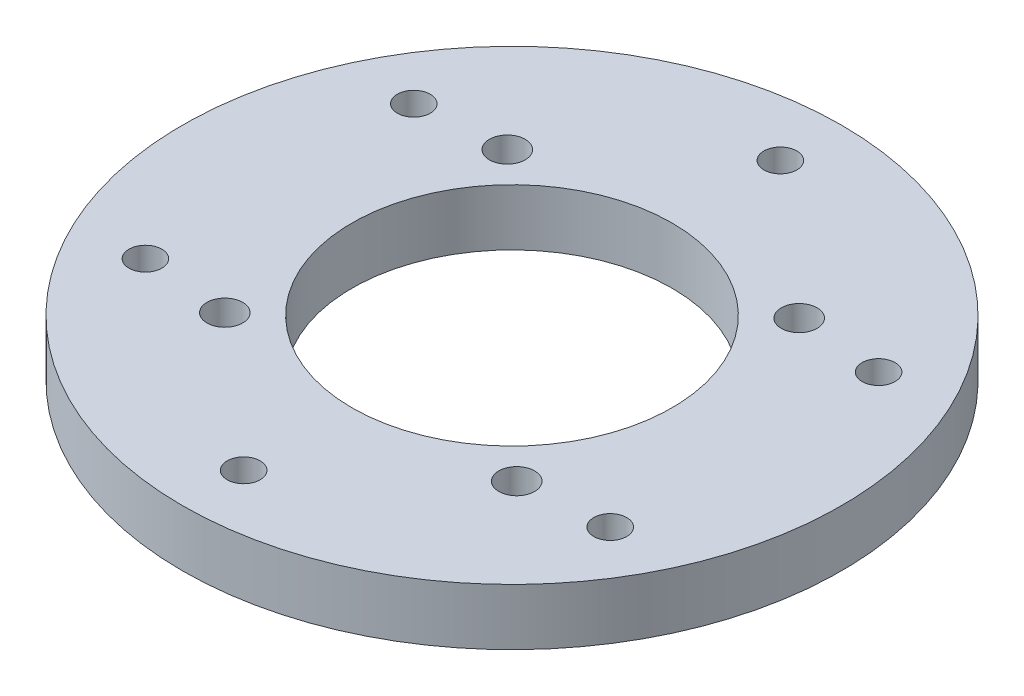
ISO-10303-21;
HEADER;
FILE_DESCRIPTION(('STEP AP214'),'2;1');
FILE_NAME('part.step','',(''),(''),'','','');
FILE_SCHEMA(('AUTOMOTIVE_DESIGN { 1 0 10303 214 1 1 1 1 }'));
ENDSEC;
DATA;
#1=APPLICATION_CONTEXT('core data for automotive mechanical design processes');
#2=APPLICATION_PROTOCOL_DEFINITION('international standard','automotive_design',2000,#1);
#3=PRODUCT_CONTEXT('',#1,'mechanical');
#4=PRODUCT('Part','Part','',(#3));
#5=PRODUCT_RELATED_PRODUCT_CATEGORY('part','',(#4));
#6=PRODUCT_DEFINITION_FORMATION('','',#4);
#7=PRODUCT_DEFINITION_CONTEXT('part definition',#1,'design');
#8=PRODUCT_DEFINITION('design','',#6,#7);
#9=PRODUCT_DEFINITION_SHAPE('','',#8);
#10=(LENGTH_UNIT() NAMED_UNIT(*) SI_UNIT(.MILLI.,.METRE.));
#11=(NAMED_UNIT(*) PLANE_ANGLE_UNIT() SI_UNIT($,.RADIAN.));
#12=(NAMED_UNIT(*) SI_UNIT($,.STERADIAN.) SOLID_ANGLE_UNIT());
#13=UNCERTAINTY_MEASURE_WITH_UNIT(LENGTH_MEASURE(1.E-05),#10,'distance_accuracy_value','');
#14=(GEOMETRIC_REPRESENTATION_CONTEXT(3) GLOBAL_UNCERTAINTY_ASSIGNED_CONTEXT((#13)) GLOBAL_UNIT_ASSIGNED_CONTEXT((#10,
#11,#12)) REPRESENTATION_CONTEXT('',''));
#15=CARTESIAN_POINT('',(0.,0.,0.));
#16=DIRECTION('',(0.,0.,1.));
#17=DIRECTION('',(1.,0.,0.));
#18=AXIS2_PLACEMENT_3D('',#15,#16,#17);
#19=CARTESIAN_POINT('',(0.,6.,0.));
#20=DIRECTION('',(0.,-1.,0.));
#21=DIRECTION('',(0.,0.,-1.));
#22=AXIS2_PLACEMENT_3D('',#19,#20,#21);
#23=CYLINDRICAL_SURFACE('',#22,35.);
#24=CARTESIAN_POINT('',(0.,6.,0.));
#25=DIRECTION('',(0.,1.,0.));
#26=DIRECTION('',(0.,0.,1.));
#27=AXIS2_PLACEMENT_3D('',#24,#25,#26);
#28=CIRCLE('',#27,35.);
#29=CARTESIAN_POINT('',(0.,6.,35.));
#30=VERTEX_POINT('',#29);
#31=EDGE_CURVE('E10',#30,#30,#28,.T.);
#32=ORIENTED_EDGE('',*,*,#31,.F.);
#33=EDGE_LOOP('',(#32));
#34=FACE_BOUND('',#33,.T.);
#35=CARTESIAN_POINT('',(0.,0.,0.));
#36=DIRECTION('',(0.,1.,0.));
#37=DIRECTION('',(0.,0.,1.));
#38=AXIS2_PLACEMENT_3D('',#35,#36,#37);
#39=CIRCLE('',#38,35.);
#40=CARTESIAN_POINT('',(0.,0.,35.));
#41=VERTEX_POINT('',#40);
#42=EDGE_CURVE('E44',#41,#41,#39,.T.);
#43=ORIENTED_EDGE('',*,*,#42,.T.);
#44=EDGE_LOOP('',(#43));
#45=FACE_BOUND('',#44,.T.);
#46=ADVANCED_FACE('F37',(#34,#45),#23,.T.);
#47=CARTESIAN_POINT('',(0.,6.,0.));
#48=DIRECTION('',(0.,1.,0.));
#49=DIRECTION('',(0.,0.,1.));
#50=AXIS2_PLACEMENT_3D('',#47,#48,#49);
#51=PLANE('',#50);
#52=CARTESIAN_POINT('',(0.,6.,0.));
#53=DIRECTION('',(0.,1.,0.));
#54=DIRECTION('',(0.,0.,1.));
#55=AXIS2_PLACEMENT_3D('',#52,#53,#54);
#56=CIRCLE('',#55,17.);
#57=CARTESIAN_POINT('',(0.,6.,17.));
#58=VERTEX_POINT('',#57);
#59=EDGE_CURVE('E164',#58,#58,#56,.T.);
#60=ORIENTED_EDGE('',*,*,#59,.F.);
#61=EDGE_LOOP('',(#60));
#62=FACE_BOUND('',#61,.T.);
#63=CARTESIAN_POINT('',(-15.5,6.,-15.));
#64=DIRECTION('',(0.,1.,0.));
#65=DIRECTION('',(0.,0.,1.));
#66=AXIS2_PLACEMENT_3D('',#63,#64,#65);
#67=CIRCLE('',#66,1.90000000000001);
#68=CARTESIAN_POINT('',(-15.5,6.,-13.1));
#69=VERTEX_POINT('',#68);
#70=EDGE_CURVE('E57',#69,#69,#67,.T.);
#71=ORIENTED_EDGE('',*,*,#70,.F.);
#72=EDGE_LOOP('',(#71));
#73=FACE_BOUND('',#72,.T.);
#74=CARTESIAN_POINT('',(15.5,6.,-15.));
#75=DIRECTION('',(0.,1.,0.));
#76=DIRECTION('',(0.,0.,1.));
#77=AXIS2_PLACEMENT_3D('',#74,#75,#76);
#78=CIRCLE('',#77,1.90000000000001);
#79=CARTESIAN_POINT('',(15.5,6.,-13.1));
#80=VERTEX_POINT('',#79);
#81=EDGE_CURVE('E88',#80,#80,#78,.T.);
#82=ORIENTED_EDGE('',*,*,#81,.F.);
#83=EDGE_LOOP('',(#82));
#84=FACE_BOUND('',#83,.T.);
#85=CARTESIAN_POINT('',(15.5,6.,15.));
#86=DIRECTION('',(0.,1.,0.));
#87=DIRECTION('',(0.,0.,1.));
#88=AXIS2_PLACEMENT_3D('',#85,#86,#87);
#89=CIRCLE('',#88,1.90000000000001);
#90=CARTESIAN_POINT('',(15.5,6.,16.9));
#91=VERTEX_POINT('',#90);
#92=EDGE_CURVE('E91',#91,#91,#89,.T.);
#93=ORIENTED_EDGE('',*,*,#92,.F.);
#94=EDGE_LOOP('',(#93));
#95=FACE_BOUND('',#94,.T.);
#96=CARTESIAN_POINT('',(-15.5,6.,15.));
#97=DIRECTION('',(0.,1.,0.));
#98=DIRECTION('',(0.,0.,1.));
#99=AXIS2_PLACEMENT_3D('',#96,#97,#98);
#100=CIRCLE('',#99,1.90000000000001);
#101=CARTESIAN_POINT('',(-15.5,6.,16.9));
#102=VERTEX_POINT('',#101);
#103=EDGE_CURVE('E94',#102,#102,#100,.T.);
#104=ORIENTED_EDGE('',*,*,#103,.F.);
#105=EDGE_LOOP('',(#104));
#106=FACE_BOUND('',#105,.T.);
#107=CARTESIAN_POINT('',(24.6817240078563,6.,-14.2500000000003));
#108=DIRECTION('',(0.,1.,0.));
#109=DIRECTION('',(0.,0.,1.));
#110=AXIS2_PLACEMENT_3D('',#107,#108,#109);
#111=CIRCLE('',#110,1.75000000000001);
#112=CARTESIAN_POINT('',(24.6817240078563,6.,-12.5000000000003));
#113=VERTEX_POINT('',#112);
#114=EDGE_CURVE('E97',#113,#113,#111,.T.);
#115=ORIENTED_EDGE('',*,*,#114,.F.);
#116=EDGE_LOOP('',(#115));
#117=FACE_BOUND('',#116,.T.);
#118=CARTESIAN_POINT('',(24.6817240078566,6.,14.2499999999998));
#119=DIRECTION('',(0.,1.,0.));
#120=DIRECTION('',(0.,0.,1.));
#121=AXIS2_PLACEMENT_3D('',#118,#119,#120);
#122=CIRCLE('',#121,1.75000000000001);
#123=CARTESIAN_POINT('',(24.6817240078566,6.,15.9999999999998));
#124=VERTEX_POINT('',#123);
#125=EDGE_CURVE('E103',#124,#124,#122,.T.);
#126=ORIENTED_EDGE('',*,*,#125,.F.);
#127=EDGE_LOOP('',(#126));
#128=FACE_BOUND('',#127,.T.);
#129=CARTESIAN_POINT('',(0.,6.,28.5));
#130=DIRECTION('',(0.,1.,0.));
#131=DIRECTION('',(0.,0.,1.));
#132=AXIS2_PLACEMENT_3D('',#129,#130,#131);
#133=CIRCLE('',#132,1.75000000000001);
#134=CARTESIAN_POINT('',(0.,6.,30.25));
#135=VERTEX_POINT('',#134);
#136=EDGE_CURVE('E109',#135,#135,#133,.T.);
#137=ORIENTED_EDGE('',*,*,#136,.F.);
#138=EDGE_LOOP('',(#137));
#139=FACE_BOUND('',#138,.T.);
#140=CARTESIAN_POINT('',(-24.6817240078564,6.,14.2500000000001));
#141=DIRECTION('',(0.,1.,0.));
#142=DIRECTION('',(0.,0.,1.));
#143=AXIS2_PLACEMENT_3D('',#140,#141,#142);
#144=CIRCLE('',#143,1.75000000000001);
#145=CARTESIAN_POINT('',(-24.6817240078564,6.,16.0000000000001));
#146=VERTEX_POINT('',#145);
#147=EDGE_CURVE('E115',#146,#146,#144,.T.);
#148=ORIENTED_EDGE('',*,*,#147,.F.);
#149=EDGE_LOOP('',(#148));
#150=FACE_BOUND('',#149,.T.);
#151=CARTESIAN_POINT('',(-24.6817240078565,6.,-14.2499999999999));
#152=DIRECTION('',(0.,1.,0.));
#153=DIRECTION('',(0.,0.,1.));
#154=AXIS2_PLACEMENT_3D('',#151,#152,#153);
#155=CIRCLE('',#154,1.75000000000001);
#156=CARTESIAN_POINT('',(-24.6817240078565,6.,-12.4999999999999));
#157=VERTEX_POINT('',#156);
#158=EDGE_CURVE('E121',#157,#157,#155,.T.);
#159=ORIENTED_EDGE('',*,*,#158,.F.);
#160=EDGE_LOOP('',(#159));
#161=FACE_BOUND('',#160,.T.);
#162=CARTESIAN_POINT('',(0.,6.,-28.5));
#163=DIRECTION('',(0.,1.,0.));
#164=DIRECTION('',(0.,0.,1.));
#165=AXIS2_PLACEMENT_3D('',#162,#163,#164);
#166=CIRCLE('',#165,1.75000000000001);
#167=CARTESIAN_POINT('',(0.,6.,-26.75));
#168=VERTEX_POINT('',#167);
#169=EDGE_CURVE('E126',#168,#168,#166,.T.);
#170=ORIENTED_EDGE('',*,*,#169,.F.);
#171=EDGE_LOOP('',(#170));
#172=FACE_BOUND('',#171,.T.);
#173=ORIENTED_EDGE('',*,*,#31,.T.);
#174=EDGE_LOOP('',(#173));
#175=FACE_BOUND('',#174,.T.);
#176=ADVANCED_FACE('F148',(#62,#73,#84,#95,#106,#117,#128,#139,#150,#161,#172,#175),#51,.T.);
#177=CARTESIAN_POINT('',(0.,0.,0.));
#178=DIRECTION('',(0.,1.,0.));
#179=DIRECTION('',(0.,0.,1.));
#180=AXIS2_PLACEMENT_3D('',#177,#178,#179);
#181=PLANE('',#180);
#182=CARTESIAN_POINT('',(0.,0.,0.));
#183=DIRECTION('',(0.,-1.,0.));
#184=DIRECTION('',(0.,0.,-1.));
#185=AXIS2_PLACEMENT_3D('',#182,#183,#184);
#186=CIRCLE('',#185,17.);
#187=CARTESIAN_POINT('',(0.,0.,-17.));
#188=VERTEX_POINT('',#187);
#189=EDGE_CURVE('E257',#188,#188,#186,.T.);
#190=ORIENTED_EDGE('',*,*,#189,.F.);
#191=EDGE_LOOP('',(#190));
#192=FACE_BOUND('',#191,.T.);
#193=CARTESIAN_POINT('',(15.5,0.,-15.));
#194=DIRECTION('',(0.,-1.,0.));
#195=DIRECTION('',(0.,0.,-1.));
#196=AXIS2_PLACEMENT_3D('',#193,#194,#195);
#197=CIRCLE('',#196,3.50000000000001);
#198=CARTESIAN_POINT('',(15.5,0.,-18.5));
#199=VERTEX_POINT('',#198);
#200=EDGE_CURVE('E259',#199,#199,#197,.T.);
#201=ORIENTED_EDGE('',*,*,#200,.F.);
#202=EDGE_LOOP('',(#201));
#203=FACE_BOUND('',#202,.T.);
#204=CARTESIAN_POINT('',(-15.5,0.,-15.));
#205=DIRECTION('',(0.,-1.,0.));
#206=DIRECTION('',(0.,0.,-1.));
#207=AXIS2_PLACEMENT_3D('',#204,#205,#206);
#208=CIRCLE('',#207,3.50000000000001);
#209=CARTESIAN_POINT('',(-15.5,0.,-18.5));
#210=VERTEX_POINT('',#209);
#211=EDGE_CURVE('E72',#210,#210,#208,.T.);
#212=ORIENTED_EDGE('',*,*,#211,.F.);
#213=EDGE_LOOP('',(#212));
#214=FACE_BOUND('',#213,.T.);
#215=CARTESIAN_POINT('',(-15.5,0.,15.));
#216=DIRECTION('',(0.,-1.,0.));
#217=DIRECTION('',(0.,0.,-1.));
#218=AXIS2_PLACEMENT_3D('',#215,#216,#217);
#219=CIRCLE('',#218,3.50000000000001);
#220=CARTESIAN_POINT('',(-15.5,0.,11.5));
#221=VERTEX_POINT('',#220);
#222=EDGE_CURVE('E65',#221,#221,#219,.T.);
#223=ORIENTED_EDGE('',*,*,#222,.F.);
#224=EDGE_LOOP('',(#223));
#225=FACE_BOUND('',#224,.T.);
#226=CARTESIAN_POINT('',(15.5,0.,15.));
#227=DIRECTION('',(0.,-1.,0.));
#228=DIRECTION('',(0.,0.,-1.));
#229=AXIS2_PLACEMENT_3D('',#226,#227,#228);
#230=CIRCLE('',#229,3.50000000000002);
#231=CARTESIAN_POINT('',(15.5,0.,11.5));
#232=VERTEX_POINT('',#231);
#233=EDGE_CURVE('E61',#232,#232,#230,.T.);
#234=ORIENTED_EDGE('',*,*,#233,.F.);
#235=EDGE_LOOP('',(#234));
#236=FACE_BOUND('',#235,.T.);
#237=CARTESIAN_POINT('',(24.6817240078563,0.,-14.2500000000003));
#238=DIRECTION('',(0.,1.,0.));
#239=DIRECTION('',(0.,0.,1.));
#240=AXIS2_PLACEMENT_3D('',#237,#238,#239);
#241=CIRCLE('',#240,1.75000000000001);
#242=CARTESIAN_POINT('',(24.6817240078563,0.,-12.5000000000003));
#243=VERTEX_POINT('',#242);
#244=EDGE_CURVE('E100',#243,#243,#241,.T.);
#245=ORIENTED_EDGE('',*,*,#244,.T.);
#246=EDGE_LOOP('',(#245));
#247=FACE_BOUND('',#246,.T.);
#248=CARTESIAN_POINT('',(24.6817240078566,0.,14.2499999999998));
#249=DIRECTION('',(0.,1.,0.));
#250=DIRECTION('',(0.,0.,1.));
#251=AXIS2_PLACEMENT_3D('',#248,#249,#250);
#252=CIRCLE('',#251,1.75000000000001);
#253=CARTESIAN_POINT('',(24.6817240078566,0.,15.9999999999998));
#254=VERTEX_POINT('',#253);
#255=EDGE_CURVE('E106',#254,#254,#252,.T.);
#256=ORIENTED_EDGE('',*,*,#255,.T.);
#257=EDGE_LOOP('',(#256));
#258=FACE_BOUND('',#257,.T.);
#259=CARTESIAN_POINT('',(0.,0.,28.5));
#260=DIRECTION('',(0.,1.,0.));
#261=DIRECTION('',(0.,0.,1.));
#262=AXIS2_PLACEMENT_3D('',#259,#260,#261);
#263=CIRCLE('',#262,1.75000000000001);
#264=CARTESIAN_POINT('',(0.,0.,30.25));
#265=VERTEX_POINT('',#264);
#266=EDGE_CURVE('E112',#265,#265,#263,.T.);
#267=ORIENTED_EDGE('',*,*,#266,.T.);
#268=EDGE_LOOP('',(#267));
#269=FACE_BOUND('',#268,.T.);
#270=CARTESIAN_POINT('',(-24.6817240078564,0.,14.2500000000001));
#271=DIRECTION('',(0.,1.,0.));
#272=DIRECTION('',(0.,0.,1.));
#273=AXIS2_PLACEMENT_3D('',#270,#271,#272);
#274=CIRCLE('',#273,1.75000000000001);
#275=CARTESIAN_POINT('',(-24.6817240078564,0.,16.0000000000001));
#276=VERTEX_POINT('',#275);
#277=EDGE_CURVE('E118',#276,#276,#274,.T.);
#278=ORIENTED_EDGE('',*,*,#277,.T.);
#279=EDGE_LOOP('',(#278));
#280=FACE_BOUND('',#279,.T.);
#281=CARTESIAN_POINT('',(-24.6817240078565,0.,-14.2499999999999));
#282=DIRECTION('',(0.,1.,0.));
#283=DIRECTION('',(0.,0.,1.));
#284=AXIS2_PLACEMENT_3D('',#281,#282,#283);
#285=CIRCLE('',#284,1.75000000000001);
#286=CARTESIAN_POINT('',(-24.6817240078565,0.,-12.4999999999999));
#287=VERTEX_POINT('',#286);
#288=EDGE_CURVE('E124',#287,#287,#285,.T.);
#289=ORIENTED_EDGE('',*,*,#288,.T.);
#290=EDGE_LOOP('',(#289));
#291=FACE_BOUND('',#290,.T.);
#292=CARTESIAN_POINT('',(0.,0.,-28.5));
#293=DIRECTION('',(0.,1.,0.));
#294=DIRECTION('',(0.,0.,1.));
#295=AXIS2_PLACEMENT_3D('',#292,#293,#294);
#296=CIRCLE('',#295,1.75000000000001);
#297=CARTESIAN_POINT('',(0.,0.,-26.75));
#298=VERTEX_POINT('',#297);
#299=EDGE_CURVE('E49',#298,#298,#296,.T.);
#300=ORIENTED_EDGE('',*,*,#299,.T.);
#301=EDGE_LOOP('',(#300));
#302=FACE_BOUND('',#301,.T.);
#303=ORIENTED_EDGE('',*,*,#42,.F.);
#304=EDGE_LOOP('',(#303));
#305=FACE_BOUND('',#304,.T.);
#306=ADVANCED_FACE('F133',(#192,#203,#214,#225,#236,#247,#258,#269,#280,#291,#302,#305),#181,.F.);
#307=CARTESIAN_POINT('',(0.,6.,-28.5));
#308=DIRECTION('',(0.,1.,0.));
#309=DIRECTION('',(0.,0.,1.));
#310=AXIS2_PLACEMENT_3D('',#307,#308,#309);
#311=CYLINDRICAL_SURFACE('',#310,1.75000000000001);
#312=ORIENTED_EDGE('',*,*,#299,.F.);
#313=EDGE_LOOP('',(#312));
#314=FACE_BOUND('',#313,.T.);
#315=ORIENTED_EDGE('',*,*,#169,.T.);
#316=EDGE_LOOP('',(#315));
#317=FACE_BOUND('',#316,.T.);
#318=ADVANCED_FACE('F136',(#314,#317),#311,.F.);
#319=CARTESIAN_POINT('',(-24.6817240078565,6.,-14.2499999999999));
#320=DIRECTION('',(0.,1.,0.));
#321=DIRECTION('',(0.,0.,1.));
#322=AXIS2_PLACEMENT_3D('',#319,#320,#321);
#323=CYLINDRICAL_SURFACE('',#322,1.75000000000001);
#324=ORIENTED_EDGE('',*,*,#288,.F.);
#325=EDGE_LOOP('',(#324));
#326=FACE_BOUND('',#325,.T.);
#327=ORIENTED_EDGE('',*,*,#158,.T.);
#328=EDGE_LOOP('',(#327));
#329=FACE_BOUND('',#328,.T.);
#330=ADVANCED_FACE('F138',(#326,#329),#323,.F.);
#331=CARTESIAN_POINT('',(-24.6817240078564,6.,14.2500000000001));
#332=DIRECTION('',(0.,1.,0.));
#333=DIRECTION('',(0.,0.,1.));
#334=AXIS2_PLACEMENT_3D('',#331,#332,#333);
#335=CYLINDRICAL_SURFACE('',#334,1.75000000000001);
#336=ORIENTED_EDGE('',*,*,#277,.F.);
#337=EDGE_LOOP('',(#336));
#338=FACE_BOUND('',#337,.T.);
#339=ORIENTED_EDGE('',*,*,#147,.T.);
#340=EDGE_LOOP('',(#339));
#341=FACE_BOUND('',#340,.T.);
#342=ADVANCED_FACE('F144',(#338,#341),#335,.F.);
#343=CARTESIAN_POINT('',(0.,6.,28.5));
#344=DIRECTION('',(0.,1.,0.));
#345=DIRECTION('',(0.,0.,1.));
#346=AXIS2_PLACEMENT_3D('',#343,#344,#345);
#347=CYLINDRICAL_SURFACE('',#346,1.75000000000001);
#348=ORIENTED_EDGE('',*,*,#266,.F.);
#349=EDGE_LOOP('',(#348));
#350=FACE_BOUND('',#349,.T.);
#351=ORIENTED_EDGE('',*,*,#136,.T.);
#352=EDGE_LOOP('',(#351));
#353=FACE_BOUND('',#352,.T.);
#354=ADVANCED_FACE('F186',(#350,#353),#347,.F.);
#355=CARTESIAN_POINT('',(24.6817240078566,6.,14.2499999999998));
#356=DIRECTION('',(0.,1.,0.));
#357=DIRECTION('',(0.,0.,1.));
#358=AXIS2_PLACEMENT_3D('',#355,#356,#357);
#359=CYLINDRICAL_SURFACE('',#358,1.75000000000001);
#360=ORIENTED_EDGE('',*,*,#255,.F.);
#361=EDGE_LOOP('',(#360));
#362=FACE_BOUND('',#361,.T.);
#363=ORIENTED_EDGE('',*,*,#125,.T.);
#364=EDGE_LOOP('',(#363));
#365=FACE_BOUND('',#364,.T.);
#366=ADVANCED_FACE('F192',(#362,#365),#359,.F.);
#367=CARTESIAN_POINT('',(24.6817240078563,6.,-14.2500000000003));
#368=DIRECTION('',(0.,1.,0.));
#369=DIRECTION('',(0.,0.,1.));
#370=AXIS2_PLACEMENT_3D('',#367,#368,#369);
#371=CYLINDRICAL_SURFACE('',#370,1.75000000000001);
#372=ORIENTED_EDGE('',*,*,#244,.F.);
#373=EDGE_LOOP('',(#372));
#374=FACE_BOUND('',#373,.T.);
#375=ORIENTED_EDGE('',*,*,#114,.T.);
#376=EDGE_LOOP('',(#375));
#377=FACE_BOUND('',#376,.T.);
#378=ADVANCED_FACE('F199',(#374,#377),#371,.F.);
#379=CARTESIAN_POINT('',(-15.5,6.,15.));
#380=DIRECTION('',(0.,1.,0.));
#381=DIRECTION('',(0.,0.,1.));
#382=AXIS2_PLACEMENT_3D('',#379,#380,#381);
#383=CYLINDRICAL_SURFACE('',#382,1.90000000000001);
#384=CARTESIAN_POINT('',(-15.5,1.5,15.));
#385=DIRECTION('',(0.,1.,0.));
#386=DIRECTION('',(0.,0.,1.));
#387=AXIS2_PLACEMENT_3D('',#384,#385,#386);
#388=CIRCLE('',#387,1.90000000000001);
#389=CARTESIAN_POINT('',(-15.5,1.5,16.9));
#390=VERTEX_POINT('',#389);
#391=EDGE_CURVE('E59',#390,#390,#388,.F.);
#392=ORIENTED_EDGE('',*,*,#391,.T.);
#393=EDGE_LOOP('',(#392));
#394=FACE_BOUND('',#393,.T.);
#395=ORIENTED_EDGE('',*,*,#103,.T.);
#396=EDGE_LOOP('',(#395));
#397=FACE_BOUND('',#396,.T.);
#398=ADVANCED_FACE('F203',(#394,#397),#383,.F.);
#399=CARTESIAN_POINT('',(15.5,6.,15.));
#400=DIRECTION('',(0.,1.,0.));
#401=DIRECTION('',(0.,0.,1.));
#402=AXIS2_PLACEMENT_3D('',#399,#400,#401);
#403=CYLINDRICAL_SURFACE('',#402,1.90000000000001);
#404=CARTESIAN_POINT('',(15.5,1.5,15.));
#405=DIRECTION('',(0.,1.,0.));
#406=DIRECTION('',(0.,0.,1.));
#407=AXIS2_PLACEMENT_3D('',#404,#405,#406);
#408=CIRCLE('',#407,1.90000000000001);
#409=CARTESIAN_POINT('',(15.5,1.5,16.9));
#410=VERTEX_POINT('',#409);
#411=EDGE_CURVE('E54',#410,#410,#408,.F.);
#412=ORIENTED_EDGE('',*,*,#411,.T.);
#413=EDGE_LOOP('',(#412));
#414=FACE_BOUND('',#413,.T.);
#415=ORIENTED_EDGE('',*,*,#92,.T.);
#416=EDGE_LOOP('',(#415));
#417=FACE_BOUND('',#416,.T.);
#418=ADVANCED_FACE('F207',(#414,#417),#403,.F.);
#419=CARTESIAN_POINT('',(15.5,6.,-15.));
#420=DIRECTION('',(0.,1.,0.));
#421=DIRECTION('',(0.,0.,1.));
#422=AXIS2_PLACEMENT_3D('',#419,#420,#421);
#423=CYLINDRICAL_SURFACE('',#422,1.90000000000001);
#424=CARTESIAN_POINT('',(15.5,1.5,-15.));
#425=DIRECTION('',(0.,1.,0.));
#426=DIRECTION('',(0.,0.,1.));
#427=AXIS2_PLACEMENT_3D('',#424,#425,#426);
#428=CIRCLE('',#427,1.90000000000001);
#429=CARTESIAN_POINT('',(15.5,1.5,-13.1));
#430=VERTEX_POINT('',#429);
#431=EDGE_CURVE('E40',#430,#430,#428,.F.);
#432=ORIENTED_EDGE('',*,*,#431,.T.);
#433=EDGE_LOOP('',(#432));
#434=FACE_BOUND('',#433,.T.);
#435=ORIENTED_EDGE('',*,*,#81,.T.);
#436=EDGE_LOOP('',(#435));
#437=FACE_BOUND('',#436,.T.);
#438=ADVANCED_FACE('F211',(#434,#437),#423,.F.);
#439=CARTESIAN_POINT('',(-15.5,6.,-15.));
#440=DIRECTION('',(0.,1.,0.));
#441=DIRECTION('',(0.,0.,1.));
#442=AXIS2_PLACEMENT_3D('',#439,#440,#441);
#443=CYLINDRICAL_SURFACE('',#442,1.90000000000001);
#444=CARTESIAN_POINT('',(-15.5,1.5,-15.));
#445=DIRECTION('',(0.,1.,0.));
#446=DIRECTION('',(0.,0.,1.));
#447=AXIS2_PLACEMENT_3D('',#444,#445,#446);
#448=CIRCLE('',#447,1.90000000000001);
#449=CARTESIAN_POINT('',(-15.5,1.5,-13.1));
#450=VERTEX_POINT('',#449);
#451=EDGE_CURVE('E63',#450,#450,#448,.F.);
#452=ORIENTED_EDGE('',*,*,#451,.T.);
#453=EDGE_LOOP('',(#452));
#454=FACE_BOUND('',#453,.T.);
#455=ORIENTED_EDGE('',*,*,#70,.T.);
#456=EDGE_LOOP('',(#455));
#457=FACE_BOUND('',#456,.T.);
#458=ADVANCED_FACE('F215',(#454,#457),#443,.F.);
#459=CARTESIAN_POINT('',(15.5,1.5,15.));
#460=DIRECTION('',(0.,1.,0.));
#461=DIRECTION('',(0.,0.,1.));
#462=AXIS2_PLACEMENT_3D('',#459,#460,#461);
#463=PLANE('',#462);
#464=CARTESIAN_POINT('',(15.5,1.5,15.));
#465=DIRECTION('',(0.,-1.,0.));
#466=DIRECTION('',(0.,0.,-1.));
#467=AXIS2_PLACEMENT_3D('',#464,#465,#466);
#468=CIRCLE('',#467,3.50000000000001);
#469=CARTESIAN_POINT('',(15.5,1.5,11.5));
#470=VERTEX_POINT('',#469);
#471=EDGE_CURVE('E58',#470,#470,#468,.T.);
#472=ORIENTED_EDGE('',*,*,#471,.T.);
#473=EDGE_LOOP('',(#472));
#474=FACE_BOUND('',#473,.T.);
#475=ORIENTED_EDGE('',*,*,#411,.F.);
#476=EDGE_LOOP('',(#475));
#477=FACE_BOUND('',#476,.T.);
#478=ADVANCED_FACE('F219',(#474,#477),#463,.F.);
#479=CARTESIAN_POINT('',(15.5,0.,15.));
#480=DIRECTION('',(0.,-1.,0.));
#481=DIRECTION('',(0.,0.,-1.));
#482=AXIS2_PLACEMENT_3D('',#479,#480,#481);
#483=CYLINDRICAL_SURFACE('',#482,3.50000000000001);
#484=ORIENTED_EDGE('',*,*,#471,.F.);
#485=EDGE_LOOP('',(#484));
#486=FACE_BOUND('',#485,.T.);
#487=ORIENTED_EDGE('',*,*,#233,.T.);
#488=EDGE_LOOP('',(#487));
#489=FACE_BOUND('',#488,.T.);
#490=ADVANCED_FACE('F222',(#486,#489),#483,.F.);
#491=CARTESIAN_POINT('',(-15.5,1.5,15.));
#492=DIRECTION('',(0.,1.,0.));
#493=DIRECTION('',(0.,0.,1.));
#494=AXIS2_PLACEMENT_3D('',#491,#492,#493);
#495=PLANE('',#494);
#496=CARTESIAN_POINT('',(-15.5,1.5,15.));
#497=DIRECTION('',(0.,-1.,0.));
#498=DIRECTION('',(0.,0.,-1.));
#499=AXIS2_PLACEMENT_3D('',#496,#497,#498);
#500=CIRCLE('',#499,3.50000000000001);
#501=CARTESIAN_POINT('',(-15.5,1.5,11.5));
#502=VERTEX_POINT('',#501);
#503=EDGE_CURVE('E62',#502,#502,#500,.T.);
#504=ORIENTED_EDGE('',*,*,#503,.T.);
#505=EDGE_LOOP('',(#504));
#506=FACE_BOUND('',#505,.T.);
#507=ORIENTED_EDGE('',*,*,#391,.F.);
#508=EDGE_LOOP('',(#507));
#509=FACE_BOUND('',#508,.T.);
#510=ADVANCED_FACE('F226',(#506,#509),#495,.F.);
#511=CARTESIAN_POINT('',(-15.5,0.,15.));
#512=DIRECTION('',(0.,-1.,0.));
#513=DIRECTION('',(0.,0.,-1.));
#514=AXIS2_PLACEMENT_3D('',#511,#512,#513);
#515=CYLINDRICAL_SURFACE('',#514,3.50000000000001);
#516=ORIENTED_EDGE('',*,*,#503,.F.);
#517=EDGE_LOOP('',(#516));
#518=FACE_BOUND('',#517,.T.);
#519=ORIENTED_EDGE('',*,*,#222,.T.);
#520=EDGE_LOOP('',(#519));
#521=FACE_BOUND('',#520,.T.);
#522=ADVANCED_FACE('F230',(#518,#521),#515,.F.);
#523=CARTESIAN_POINT('',(-15.5,1.5,-15.));
#524=DIRECTION('',(0.,1.,0.));
#525=DIRECTION('',(0.,0.,1.));
#526=AXIS2_PLACEMENT_3D('',#523,#524,#525);
#527=PLANE('',#526);
#528=CARTESIAN_POINT('',(-15.5,1.5,-15.));
#529=DIRECTION('',(0.,-1.,0.));
#530=DIRECTION('',(0.,0.,-1.));
#531=AXIS2_PLACEMENT_3D('',#528,#529,#530);
#532=CIRCLE('',#531,3.50000000000001);
#533=CARTESIAN_POINT('',(-15.5,1.5,-18.5));
#534=VERTEX_POINT('',#533);
#535=EDGE_CURVE('E66',#534,#534,#532,.T.);
#536=ORIENTED_EDGE('',*,*,#535,.T.);
#537=EDGE_LOOP('',(#536));
#538=FACE_BOUND('',#537,.T.);
#539=ORIENTED_EDGE('',*,*,#451,.F.);
#540=EDGE_LOOP('',(#539));
#541=FACE_BOUND('',#540,.T.);
#542=ADVANCED_FACE('F234',(#538,#541),#527,.F.);
#543=CARTESIAN_POINT('',(-15.5,0.,-15.));
#544=DIRECTION('',(0.,-1.,0.));
#545=DIRECTION('',(0.,0.,-1.));
#546=AXIS2_PLACEMENT_3D('',#543,#544,#545);
#547=CYLINDRICAL_SURFACE('',#546,3.50000000000001);
#548=ORIENTED_EDGE('',*,*,#535,.F.);
#549=EDGE_LOOP('',(#548));
#550=FACE_BOUND('',#549,.T.);
#551=ORIENTED_EDGE('',*,*,#211,.T.);
#552=EDGE_LOOP('',(#551));
#553=FACE_BOUND('',#552,.T.);
#554=ADVANCED_FACE('F238',(#550,#553),#547,.F.);
#555=CARTESIAN_POINT('',(15.5,1.5,-15.));
#556=DIRECTION('',(0.,1.,0.));
#557=DIRECTION('',(0.,0.,1.));
#558=AXIS2_PLACEMENT_3D('',#555,#556,#557);
#559=PLANE('',#558);
#560=CARTESIAN_POINT('',(15.5,1.5,-15.));
#561=DIRECTION('',(0.,-1.,0.));
#562=DIRECTION('',(0.,0.,-1.));
#563=AXIS2_PLACEMENT_3D('',#560,#561,#562);
#564=CIRCLE('',#563,3.50000000000001);
#565=CARTESIAN_POINT('',(15.5,1.5,-18.5));
#566=VERTEX_POINT('',#565);
#567=EDGE_CURVE('E263',#566,#566,#564,.T.);
#568=ORIENTED_EDGE('',*,*,#567,.T.);
#569=EDGE_LOOP('',(#568));
#570=FACE_BOUND('',#569,.T.);
#571=ORIENTED_EDGE('',*,*,#431,.F.);
#572=EDGE_LOOP('',(#571));
#573=FACE_BOUND('',#572,.T.);
#574=ADVANCED_FACE('F241',(#570,#573),#559,.F.);
#575=CARTESIAN_POINT('',(15.5,0.,-15.));
#576=DIRECTION('',(0.,-1.,0.));
#577=DIRECTION('',(0.,0.,-1.));
#578=AXIS2_PLACEMENT_3D('',#575,#576,#577);
#579=CYLINDRICAL_SURFACE('',#578,3.50000000000001);
#580=ORIENTED_EDGE('',*,*,#567,.F.);
#581=EDGE_LOOP('',(#580));
#582=FACE_BOUND('',#581,.T.);
#583=ORIENTED_EDGE('',*,*,#200,.T.);
#584=EDGE_LOOP('',(#583));
#585=FACE_BOUND('',#584,.T.);
#586=ADVANCED_FACE('F245',(#582,#585),#579,.F.);
#587=CARTESIAN_POINT('',(0.,10.,0.));
#588=DIRECTION('',(0.,-1.,0.));
#589=DIRECTION('',(0.,0.,-1.));
#590=AXIS2_PLACEMENT_3D('',#587,#588,#589);
#591=CYLINDRICAL_SURFACE('',#590,17.);
#592=ORIENTED_EDGE('',*,*,#59,.T.);
#593=EDGE_LOOP('',(#592));
#594=FACE_BOUND('',#593,.T.);
#595=ORIENTED_EDGE('',*,*,#189,.T.);
#596=EDGE_LOOP('',(#595));
#597=FACE_BOUND('',#596,.T.);
#598=ADVANCED_FACE('F248',(#594,#597),#591,.F.);
#599=CLOSED_SHELL('',(#46,#176,#306,#318,#330,#342,#354,#366,#378,#398,#418,#438,#458,#478,#490,
#510,#522,#542,#554,#574,#586,#598));
#600=MANIFOLD_SOLID_BREP('B2',#599);
#601=ADVANCED_BREP_SHAPE_REPRESENTATION('',(#18,#600),#14);
#602=SHAPE_DEFINITION_REPRESENTATION(#9,#601);
ENDSEC;
END-ISO-10303-21;
